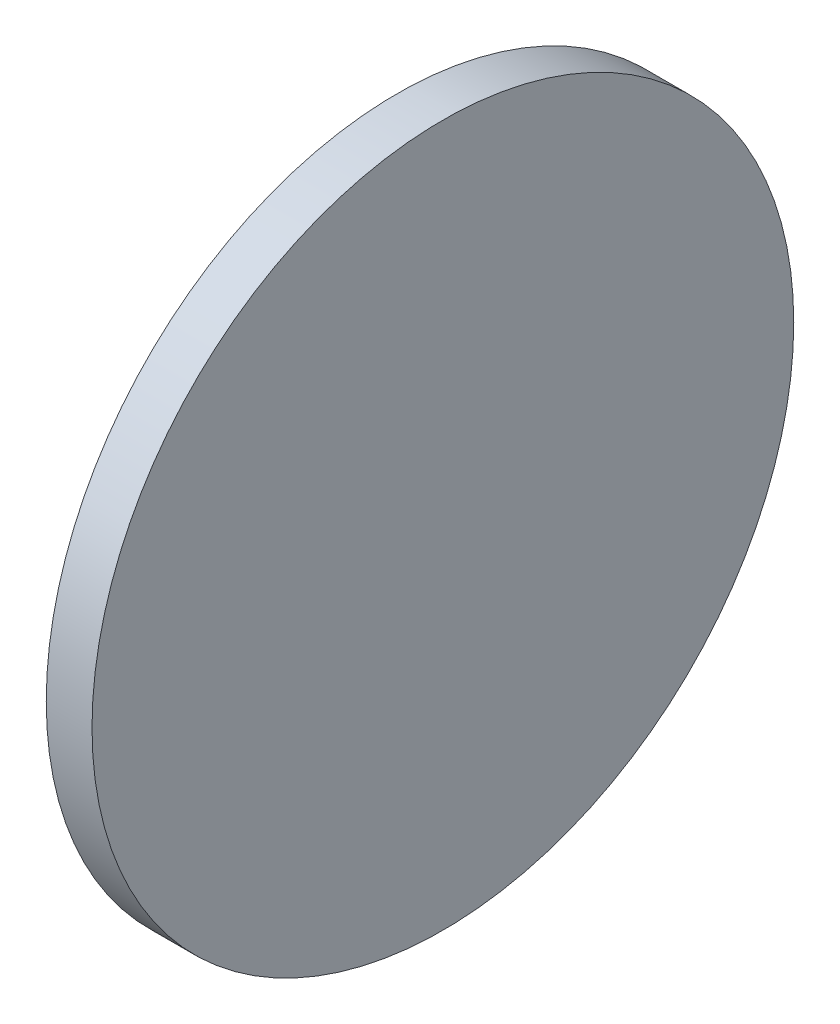
ISO-10303-21;
HEADER;
FILE_DESCRIPTION(('STEP AP214'),'2;1');
FILE_NAME('part.step','',(''),(''),'','','');
FILE_SCHEMA(('AUTOMOTIVE_DESIGN { 1 0 10303 214 1 1 1 1 }'));
ENDSEC;
DATA;
#1=APPLICATION_CONTEXT('core data for automotive mechanical design processes');
#2=APPLICATION_PROTOCOL_DEFINITION('international standard','automotive_design',2000,#1);
#3=PRODUCT_CONTEXT('',#1,'mechanical');
#4=PRODUCT('Part','Part','',(#3));
#5=PRODUCT_RELATED_PRODUCT_CATEGORY('part','',(#4));
#6=PRODUCT_DEFINITION_FORMATION('','',#4);
#7=PRODUCT_DEFINITION_CONTEXT('part definition',#1,'design');
#8=PRODUCT_DEFINITION('design','',#6,#7);
#9=PRODUCT_DEFINITION_SHAPE('','',#8);
#10=(LENGTH_UNIT() NAMED_UNIT(*) SI_UNIT(.MILLI.,.METRE.));
#11=(NAMED_UNIT(*) PLANE_ANGLE_UNIT() SI_UNIT($,.RADIAN.));
#12=(NAMED_UNIT(*) SI_UNIT($,.STERADIAN.) SOLID_ANGLE_UNIT());
#13=UNCERTAINTY_MEASURE_WITH_UNIT(LENGTH_MEASURE(1.E-05),#10,'distance_accuracy_value','');
#14=(GEOMETRIC_REPRESENTATION_CONTEXT(3) GLOBAL_UNCERTAINTY_ASSIGNED_CONTEXT((#13)) GLOBAL_UNIT_ASSIGNED_CONTEXT((#10,
#11,#12)) REPRESENTATION_CONTEXT('',''));
#15=CARTESIAN_POINT('',(0.,0.,0.));
#16=DIRECTION('',(0.,0.,1.));
#17=DIRECTION('',(1.,0.,0.));
#18=AXIS2_PLACEMENT_3D('',#15,#16,#17);
#19=CARTESIAN_POINT('',(0.,-58.1371252928239,57.5));
#20=DIRECTION('',(-1.,0.,0.));
#21=DIRECTION('',(0.,1.,0.));
#22=AXIS2_PLACEMENT_3D('',#19,#20,#21);
#23=PLANE('',#22);
#24=CARTESIAN_POINT('',(0.,0.,0.));
#25=DIRECTION('',(-1.,0.,0.));
#26=DIRECTION('',(0.,0.,-1.));
#27=AXIS2_PLACEMENT_3D('',#24,#25,#26);
#28=CIRCLE('',#27,57.5);
#29=CARTESIAN_POINT('',(0.,0.,-57.5));
#30=VERTEX_POINT('',#29);
#31=EDGE_CURVE('E22',#30,#30,#28,.F.);
#32=ORIENTED_EDGE('',*,*,#31,.F.);
#33=EDGE_LOOP('',(#32));
#34=FACE_BOUND('',#33,.T.);
#35=ADVANCED_FACE('F15',(#34),#23,.T.);
#36=CARTESIAN_POINT('',(7.5,-58.1371252928239,-57.5));
#37=DIRECTION('',(1.,0.,0.));
#38=DIRECTION('',(0.,1.,0.));
#39=AXIS2_PLACEMENT_3D('',#36,#37,#38);
#40=PLANE('',#39);
#41=CARTESIAN_POINT('',(7.5,0.,0.));
#42=DIRECTION('',(1.,0.,0.));
#43=DIRECTION('',(0.,0.,1.));
#44=AXIS2_PLACEMENT_3D('',#41,#42,#43);
#45=CIRCLE('',#44,57.5);
#46=CARTESIAN_POINT('',(7.5,0.,57.5));
#47=VERTEX_POINT('',#46);
#48=EDGE_CURVE('E10',#47,#47,#45,.T.);
#49=ORIENTED_EDGE('',*,*,#48,.T.);
#50=EDGE_LOOP('',(#49));
#51=FACE_BOUND('',#50,.T.);
#52=ADVANCED_FACE('F30',(#51),#40,.T.);
#53=CARTESIAN_POINT('',(7.5,0.,0.));
#54=DIRECTION('',(1.,0.,0.));
#55=DIRECTION('',(0.,0.,1.));
#56=AXIS2_PLACEMENT_3D('',#53,#54,#55);
#57=CYLINDRICAL_SURFACE('',#56,57.5);
#58=ORIENTED_EDGE('',*,*,#48,.F.);
#59=EDGE_LOOP('',(#58));
#60=FACE_BOUND('',#59,.T.);
#61=ORIENTED_EDGE('',*,*,#31,.T.);
#62=EDGE_LOOP('',(#61));
#63=FACE_BOUND('',#62,.T.);
#64=ADVANCED_FACE('F17',(#60,#63),#57,.T.);
#65=CLOSED_SHELL('',(#35,#52,#64));
#66=MANIFOLD_SOLID_BREP('B1',#65);
#67=ADVANCED_BREP_SHAPE_REPRESENTATION('',(#18,#66),#14);
#68=SHAPE_DEFINITION_REPRESENTATION(#9,#67);
ENDSEC;
END-ISO-10303-21;
